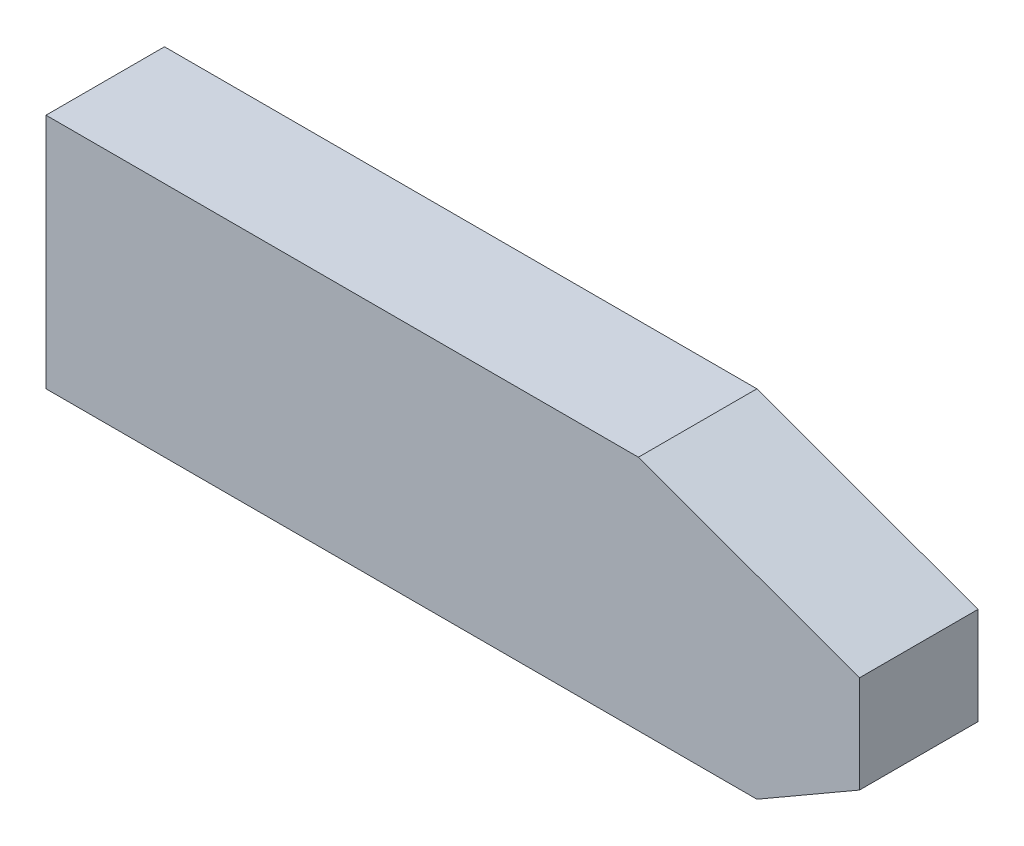
ISO-10303-21;
HEADER;
FILE_DESCRIPTION(('STEP AP214'),'2;1');
FILE_NAME('part.step','',(''),(''),'','','');
FILE_SCHEMA(('AUTOMOTIVE_DESIGN { 1 0 10303 214 1 1 1 1 }'));
ENDSEC;
DATA;
#1=APPLICATION_CONTEXT('core data for automotive mechanical design processes');
#2=APPLICATION_PROTOCOL_DEFINITION('international standard','automotive_design',2000,#1);
#3=PRODUCT_CONTEXT('',#1,'mechanical');
#4=PRODUCT('Part','Part','',(#3));
#5=PRODUCT_RELATED_PRODUCT_CATEGORY('part','',(#4));
#6=PRODUCT_DEFINITION_FORMATION('','',#4);
#7=PRODUCT_DEFINITION_CONTEXT('part definition',#1,'design');
#8=PRODUCT_DEFINITION('design','',#6,#7);
#9=PRODUCT_DEFINITION_SHAPE('','',#8);
#10=(LENGTH_UNIT() NAMED_UNIT(*) SI_UNIT(.MILLI.,.METRE.));
#11=(NAMED_UNIT(*) PLANE_ANGLE_UNIT() SI_UNIT($,.RADIAN.));
#12=(NAMED_UNIT(*) SI_UNIT($,.STERADIAN.) SOLID_ANGLE_UNIT());
#13=UNCERTAINTY_MEASURE_WITH_UNIT(LENGTH_MEASURE(1.E-05),#10,'distance_accuracy_value','');
#14=(GEOMETRIC_REPRESENTATION_CONTEXT(3) GLOBAL_UNCERTAINTY_ASSIGNED_CONTEXT((#13)) GLOBAL_UNIT_ASSIGNED_CONTEXT((#10,
#11,#12)) REPRESENTATION_CONTEXT('',''));
#15=CARTESIAN_POINT('',(0.,0.,0.));
#16=DIRECTION('',(0.,0.,1.));
#17=DIRECTION('',(1.,0.,0.));
#18=AXIS2_PLACEMENT_3D('',#15,#16,#17);
#19=CARTESIAN_POINT('',(174.397045256125,33.5488863346025,25.4));
#20=DIRECTION('',(-0.342020143325669,-0.939692620785908,0.));
#21=DIRECTION('',(0.939692620785908,-0.342020143325669,0.));
#22=AXIS2_PLACEMENT_3D('',#19,#20,#21);
#23=PLANE('',#22);
#24=DIRECTION('',(-0.939692620785908,0.342020143325669,0.));
#25=VECTOR('',#24,1.);
#26=CARTESIAN_POINT('',(174.397045256125,33.5488863346025,0.));
#27=LINE('',#26,#25);
#28=CARTESIAN_POINT('',(174.397045256125,33.5488863346025,0.));
#29=VERTEX_POINT('',#28);
#30=CARTESIAN_POINT('',(127.,50.8,0.));
#31=VERTEX_POINT('',#30);
#32=EDGE_CURVE('E134',#29,#31,#27,.T.);
#33=ORIENTED_EDGE('',*,*,#32,.T.);
#34=DIRECTION('',(0.,0.,-1.));
#35=VECTOR('',#34,1.);
#36=CARTESIAN_POINT('',(127.,50.8,25.4));
#37=LINE('',#36,#35);
#38=CARTESIAN_POINT('',(127.,50.8,25.4));
#39=VERTEX_POINT('',#38);
#40=EDGE_CURVE('E11',#39,#31,#37,.T.);
#41=ORIENTED_EDGE('',*,*,#40,.F.);
#42=DIRECTION('',(-0.939692620785908,0.342020143325669,0.));
#43=VECTOR('',#42,1.);
#44=CARTESIAN_POINT('',(174.397045256125,33.5488863346025,25.4));
#45=LINE('',#44,#43);
#46=CARTESIAN_POINT('',(174.397045256125,33.5488863346025,25.4));
#47=VERTEX_POINT('',#46);
#48=EDGE_CURVE('E150',#47,#39,#45,.T.);
#49=ORIENTED_EDGE('',*,*,#48,.F.);
#50=DIRECTION('',(0.,0.,-1.));
#51=VECTOR('',#50,1.);
#52=CARTESIAN_POINT('',(174.397045256125,33.5488863346025,25.4));
#53=LINE('',#52,#51);
#54=EDGE_CURVE('E130',#47,#29,#53,.T.);
#55=ORIENTED_EDGE('',*,*,#54,.T.);
#56=EDGE_LOOP('',(#33,#41,#49,#55));
#57=FACE_BOUND('',#56,.T.);
#58=ADVANCED_FACE('F45',(#57),#23,.F.);
#59=CARTESIAN_POINT('',(127.,50.8,25.4));
#60=DIRECTION('',(0.,-1.,0.));
#61=DIRECTION('',(1.,0.,0.));
#62=AXIS2_PLACEMENT_3D('',#59,#60,#61);
#63=PLANE('',#62);
#64=DIRECTION('',(-1.,0.,0.));
#65=VECTOR('',#64,1.);
#66=CARTESIAN_POINT('',(127.,50.8,0.));
#67=LINE('',#66,#65);
#68=CARTESIAN_POINT('',(0.,50.8,0.));
#69=VERTEX_POINT('',#68);
#70=EDGE_CURVE('E138',#31,#69,#67,.T.);
#71=ORIENTED_EDGE('',*,*,#70,.T.);
#72=DIRECTION('',(0.,0.,-1.));
#73=VECTOR('',#72,1.);
#74=CARTESIAN_POINT('',(0.,50.8,25.4));
#75=LINE('',#74,#73);
#76=CARTESIAN_POINT('',(0.,50.8,25.4));
#77=VERTEX_POINT('',#76);
#78=EDGE_CURVE('E54',#77,#69,#75,.T.);
#79=ORIENTED_EDGE('',*,*,#78,.F.);
#80=DIRECTION('',(-1.,0.,0.));
#81=VECTOR('',#80,1.);
#82=CARTESIAN_POINT('',(127.,50.8,25.4));
#83=LINE('',#82,#81);
#84=EDGE_CURVE('E99',#39,#77,#83,.T.);
#85=ORIENTED_EDGE('',*,*,#84,.F.);
#86=ORIENTED_EDGE('',*,*,#40,.T.);
#87=EDGE_LOOP('',(#71,#79,#85,#86));
#88=FACE_BOUND('',#87,.T.);
#89=ADVANCED_FACE('F178',(#88),#63,.F.);
#90=CARTESIAN_POINT('',(0.,50.8,25.4));
#91=DIRECTION('',(1.,0.,0.));
#92=DIRECTION('',(0.,1.,0.));
#93=AXIS2_PLACEMENT_3D('',#90,#91,#92);
#94=PLANE('',#93);
#95=DIRECTION('',(0.,-1.,0.));
#96=VECTOR('',#95,1.);
#97=CARTESIAN_POINT('',(0.,50.8,0.));
#98=LINE('',#97,#96);
#99=CARTESIAN_POINT('',(0.,0.,0.));
#100=VERTEX_POINT('',#99);
#101=EDGE_CURVE('E141',#69,#100,#98,.T.);
#102=ORIENTED_EDGE('',*,*,#101,.T.);
#103=DIRECTION('',(0.,0.,-1.));
#104=VECTOR('',#103,1.);
#105=CARTESIAN_POINT('',(0.,0.,25.4));
#106=LINE('',#105,#104);
#107=CARTESIAN_POINT('',(0.,0.,25.4));
#108=VERTEX_POINT('',#107);
#109=EDGE_CURVE('E123',#108,#100,#106,.T.);
#110=ORIENTED_EDGE('',*,*,#109,.F.);
#111=DIRECTION('',(0.,-1.,0.));
#112=VECTOR('',#111,1.);
#113=CARTESIAN_POINT('',(0.,50.8,25.4));
#114=LINE('',#113,#112);
#115=EDGE_CURVE('E112',#77,#108,#114,.T.);
#116=ORIENTED_EDGE('',*,*,#115,.F.);
#117=ORIENTED_EDGE('',*,*,#78,.T.);
#118=EDGE_LOOP('',(#102,#110,#116,#117));
#119=FACE_BOUND('',#118,.T.);
#120=ADVANCED_FACE('F160',(#119),#94,.F.);
#121=CARTESIAN_POINT('',(0.,0.,25.4));
#122=DIRECTION('',(0.,1.,0.));
#123=DIRECTION('',(-1.,0.,0.));
#124=AXIS2_PLACEMENT_3D('',#121,#122,#123);
#125=PLANE('',#124);
#126=DIRECTION('',(1.,0.,0.));
#127=VECTOR('',#126,1.);
#128=CARTESIAN_POINT('',(0.,0.,0.));
#129=LINE('',#128,#127);
#130=CARTESIAN_POINT('',(152.4,0.,0.));
#131=VERTEX_POINT('',#130);
#132=EDGE_CURVE('E121',#100,#131,#129,.T.);
#133=ORIENTED_EDGE('',*,*,#132,.T.);
#134=DIRECTION('',(0.,0.,-1.));
#135=VECTOR('',#134,1.);
#136=CARTESIAN_POINT('',(152.4,0.,25.4));
#137=LINE('',#136,#135);
#138=CARTESIAN_POINT('',(152.4,0.,25.4));
#139=VERTEX_POINT('',#138);
#140=EDGE_CURVE('E118',#139,#131,#137,.T.);
#141=ORIENTED_EDGE('',*,*,#140,.F.);
#142=DIRECTION('',(1.,0.,0.));
#143=VECTOR('',#142,1.);
#144=CARTESIAN_POINT('',(0.,0.,25.4));
#145=LINE('',#144,#143);
#146=EDGE_CURVE('E106',#108,#139,#145,.T.);
#147=ORIENTED_EDGE('',*,*,#146,.F.);
#148=ORIENTED_EDGE('',*,*,#109,.T.);
#149=EDGE_LOOP('',(#133,#141,#147,#148));
#150=FACE_BOUND('',#149,.T.);
#151=ADVANCED_FACE('F119',(#150),#125,.F.);
#152=CARTESIAN_POINT('',(152.4,0.,25.4));
#153=DIRECTION('',(-0.500000000000001,0.866025403784438,0.));
#154=DIRECTION('',(-0.866025403784438,-0.500000000000001,0.));
#155=AXIS2_PLACEMENT_3D('',#152,#153,#154);
#156=PLANE('',#155);
#157=DIRECTION('',(0.866025403784438,0.500000000000001,0.));
#158=VECTOR('',#157,1.);
#159=CARTESIAN_POINT('',(152.4,0.,0.));
#160=LINE('',#159,#158);
#161=CARTESIAN_POINT('',(174.397045256125,12.7000000000001,0.));
#162=VERTEX_POINT('',#161);
#163=EDGE_CURVE('E85',#131,#162,#160,.T.);
#164=ORIENTED_EDGE('',*,*,#163,.T.);
#165=DIRECTION('',(0.,0.,-1.));
#166=VECTOR('',#165,1.);
#167=CARTESIAN_POINT('',(174.397045256125,12.7000000000001,25.4));
#168=LINE('',#167,#166);
#169=CARTESIAN_POINT('',(174.397045256125,12.7000000000001,25.4));
#170=VERTEX_POINT('',#169);
#171=EDGE_CURVE('E124',#170,#162,#168,.T.);
#172=ORIENTED_EDGE('',*,*,#171,.F.);
#173=DIRECTION('',(0.866025403784438,0.500000000000001,0.));
#174=VECTOR('',#173,1.);
#175=CARTESIAN_POINT('',(152.4,0.,25.4));
#176=LINE('',#175,#174);
#177=EDGE_CURVE('E110',#139,#170,#176,.T.);
#178=ORIENTED_EDGE('',*,*,#177,.F.);
#179=ORIENTED_EDGE('',*,*,#140,.T.);
#180=EDGE_LOOP('',(#164,#172,#178,#179));
#181=FACE_BOUND('',#180,.T.);
#182=ADVANCED_FACE('F126',(#181),#156,.F.);
#183=CARTESIAN_POINT('',(174.397045256125,12.7000000000001,25.4));
#184=DIRECTION('',(-1.,0.,0.));
#185=DIRECTION('',(0.,0.,1.));
#186=AXIS2_PLACEMENT_3D('',#183,#184,#185);
#187=PLANE('',#186);
#188=DIRECTION('',(0.,1.,0.));
#189=VECTOR('',#188,1.);
#190=CARTESIAN_POINT('',(174.397045256125,12.7000000000001,0.));
#191=LINE('',#190,#189);
#192=EDGE_CURVE('E91',#162,#29,#191,.T.);
#193=ORIENTED_EDGE('',*,*,#192,.T.);
#194=ORIENTED_EDGE('',*,*,#54,.F.);
#195=DIRECTION('',(0.,1.,0.));
#196=VECTOR('',#195,1.);
#197=CARTESIAN_POINT('',(174.397045256125,12.7000000000001,25.4));
#198=LINE('',#197,#196);
#199=EDGE_CURVE('E62',#170,#47,#198,.T.);
#200=ORIENTED_EDGE('',*,*,#199,.F.);
#201=ORIENTED_EDGE('',*,*,#171,.T.);
#202=EDGE_LOOP('',(#193,#194,#200,#201));
#203=FACE_BOUND('',#202,.T.);
#204=ADVANCED_FACE('F167',(#203),#187,.F.);
#205=CARTESIAN_POINT('',(0.,0.,25.4));
#206=DIRECTION('',(0.,0.,1.));
#207=DIRECTION('',(1.,0.,0.));
#208=AXIS2_PLACEMENT_3D('',#205,#206,#207);
#209=PLANE('',#208);
#210=ORIENTED_EDGE('',*,*,#48,.T.);
#211=ORIENTED_EDGE('',*,*,#84,.T.);
#212=ORIENTED_EDGE('',*,*,#115,.T.);
#213=ORIENTED_EDGE('',*,*,#146,.T.);
#214=ORIENTED_EDGE('',*,*,#177,.T.);
#215=ORIENTED_EDGE('',*,*,#199,.T.);
#216=EDGE_LOOP('',(#210,#211,#212,#213,#214,#215));
#217=FACE_BOUND('',#216,.T.);
#218=ADVANCED_FACE('F108',(#217),#209,.T.);
#219=CARTESIAN_POINT('',(0.,0.,0.));
#220=DIRECTION('',(0.,0.,1.));
#221=DIRECTION('',(1.,0.,0.));
#222=AXIS2_PLACEMENT_3D('',#219,#220,#221);
#223=PLANE('',#222);
#224=ORIENTED_EDGE('',*,*,#32,.F.);
#225=ORIENTED_EDGE('',*,*,#192,.F.);
#226=ORIENTED_EDGE('',*,*,#163,.F.);
#227=ORIENTED_EDGE('',*,*,#132,.F.);
#228=ORIENTED_EDGE('',*,*,#101,.F.);
#229=ORIENTED_EDGE('',*,*,#70,.F.);
#230=EDGE_LOOP('',(#224,#225,#226,#227,#228,#229));
#231=FACE_BOUND('',#230,.T.);
#232=ADVANCED_FACE('F163',(#231),#223,.F.);
#233=CLOSED_SHELL('',(#58,#89,#120,#151,#182,#204,#218,#232));
#234=MANIFOLD_SOLID_BREP('B2',#233);
#235=ADVANCED_BREP_SHAPE_REPRESENTATION('',(#18,#234),#14);
#236=SHAPE_DEFINITION_REPRESENTATION(#9,#235);
ENDSEC;
END-ISO-10303-21;
